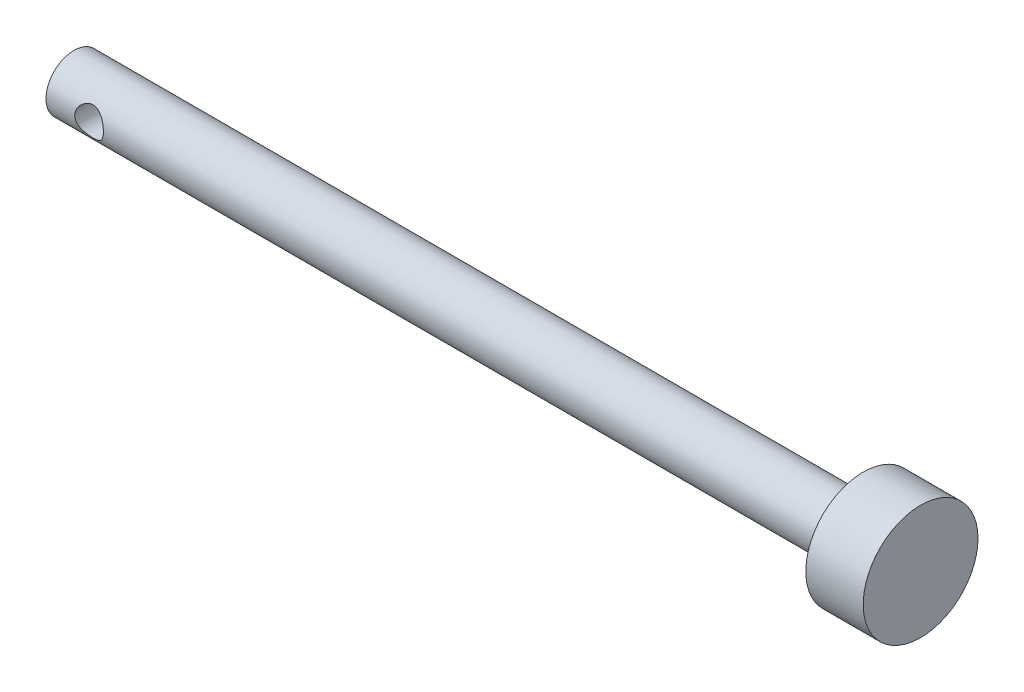
ISO-10303-21;
HEADER;
FILE_DESCRIPTION(('STEP AP214'),'2;1');
FILE_NAME('part.step','',(''),(''),'','','');
FILE_SCHEMA(('AUTOMOTIVE_DESIGN { 1 0 10303 214 1 1 1 1 }'));
ENDSEC;
DATA;
#1=APPLICATION_CONTEXT('core data for automotive mechanical design processes');
#2=APPLICATION_PROTOCOL_DEFINITION('international standard','automotive_design',2000,#1);
#3=PRODUCT_CONTEXT('',#1,'mechanical');
#4=PRODUCT('Part','Part','',(#3));
#5=PRODUCT_RELATED_PRODUCT_CATEGORY('part','',(#4));
#6=PRODUCT_DEFINITION_FORMATION('','',#4);
#7=PRODUCT_DEFINITION_CONTEXT('part definition',#1,'design');
#8=PRODUCT_DEFINITION('design','',#6,#7);
#9=PRODUCT_DEFINITION_SHAPE('','',#8);
#10=(LENGTH_UNIT() NAMED_UNIT(*) SI_UNIT(.MILLI.,.METRE.));
#11=(NAMED_UNIT(*) PLANE_ANGLE_UNIT() SI_UNIT($,.RADIAN.));
#12=(NAMED_UNIT(*) SI_UNIT($,.STERADIAN.) SOLID_ANGLE_UNIT());
#13=UNCERTAINTY_MEASURE_WITH_UNIT(LENGTH_MEASURE(1.E-05),#10,'distance_accuracy_value','');
#14=(GEOMETRIC_REPRESENTATION_CONTEXT(3) GLOBAL_UNCERTAINTY_ASSIGNED_CONTEXT((#13)) GLOBAL_UNIT_ASSIGNED_CONTEXT((#10,
#11,#12)) REPRESENTATION_CONTEXT('',''));
#15=CARTESIAN_POINT('',(0.,0.,0.));
#16=DIRECTION('',(0.,0.,1.));
#17=DIRECTION('',(1.,0.,0.));
#18=AXIS2_PLACEMENT_3D('',#15,#16,#17);
#19=CARTESIAN_POINT('',(-130.,5.,-185.068788376854));
#20=DIRECTION('',(1.,0.,0.));
#21=DIRECTION('',(0.,0.,-1.));
#22=AXIS2_PLACEMENT_3D('',#19,#20,#21);
#23=CYLINDRICAL_SURFACE('',#22,1.95);
#24=CARTESIAN_POINT('',(-130.,5.,-185.068788376854));
#25=DIRECTION('',(-1.,0.,0.));
#26=DIRECTION('',(0.,0.,1.));
#27=AXIS2_PLACEMENT_3D('',#24,#25,#26);
#28=CIRCLE('',#27,1.95);
#29=CARTESIAN_POINT('',(-130.,5.,-183.118788376854));
#30=VERTEX_POINT('',#29);
#31=EDGE_CURVE('E58',#30,#30,#28,.T.);
#32=ORIENTED_EDGE('',*,*,#31,.F.);
#33=EDGE_LOOP('',(#32));
#34=FACE_BOUND('',#33,.T.);
#35=CARTESIAN_POINT('',(-75.,5.,-185.068788376854));
#36=DIRECTION('',(-1.,0.,0.));
#37=DIRECTION('',(0.,0.,1.));
#38=AXIS2_PLACEMENT_3D('',#35,#36,#37);
#39=CIRCLE('',#38,1.95);
#40=CARTESIAN_POINT('',(-75.,5.,-183.118788376854));
#41=VERTEX_POINT('',#40);
#42=EDGE_CURVE('E10',#41,#41,#39,.T.);
#43=ORIENTED_EDGE('',*,*,#42,.T.);
#44=EDGE_LOOP('',(#43));
#45=FACE_BOUND('',#44,.T.);
#46=CARTESIAN_POINT('',(-128.,5.,-183.118788376854));
#47=CARTESIAN_POINT('',(-127.999996620464,4.94759108337758,-183.118791342641));
#48=CARTESIAN_POINT('',(-127.995855818734,4.89512459336798,-183.120923610347));
#49=CARTESIAN_POINT('',(-127.979480639985,4.79175257945733,-183.129243448775));
#50=CARTESIAN_POINT('',(-127.967231955293,4.74084998176109,-183.135438188205));
#51=CARTESIAN_POINT('',(-127.935251360128,4.64225677314356,-183.151237014264));
#52=CARTESIAN_POINT('',(-127.915549015676,4.59455433725935,-183.160827621187));
#53=CARTESIAN_POINT('',(-127.869379042361,4.50320853904555,-183.182547217429));
#54=CARTESIAN_POINT('',(-127.842911723957,4.4595649905696,-183.194676090257));
#55=CARTESIAN_POINT('',(-127.78208188139,4.37449936883816,-183.221261049136));
#56=CARTESIAN_POINT('',(-127.747328483241,4.33338798150986,-183.235815350887));
#57=CARTESIAN_POINT('',(-127.671758494067,4.25728872145519,-183.265306006449));
#58=CARTESIAN_POINT('',(-127.630937071985,4.22230577667981,-183.28024265675));
#59=CARTESIAN_POINT('',(-127.540351028353,4.15655150343715,-183.310236053727));
#60=CARTESIAN_POINT('',(-127.490126109054,4.12636720869555,-183.3252006998));
#61=CARTESIAN_POINT('',(-127.38447186519,4.07500042395737,-183.351896086809));
#62=CARTESIAN_POINT('',(-127.329046427476,4.05381127542808,-183.363629217563));
#63=CARTESIAN_POINT('',(-127.217997847935,4.02245378362002,-183.381419780872));
#64=CARTESIAN_POINT('',(-127.16259353435,4.01169137385369,-183.387780095135));
#65=CARTESIAN_POINT('',(-127.050431537177,3.99968590281392,-183.394892837093));
#66=CARTESIAN_POINT('',(-126.993675388929,3.99843251469846,-183.395651348349));
#67=CARTESIAN_POINT('',(-126.888207459916,4.00504596048992,-183.391715840623));
#68=CARTESIAN_POINT('',(-126.839392170553,4.01177101807173,-183.387704284376));
#69=CARTESIAN_POINT('',(-126.743712890883,4.03216185352695,-183.375883525344));
#70=CARTESIAN_POINT('',(-126.696849585089,4.04583004438014,-183.368073002324));
#71=CARTESIAN_POINT('',(-126.605066014851,4.07995557989579,-183.349369173851));
#72=CARTESIAN_POINT('',(-126.560215707135,4.10056255904908,-183.338408780346));
#73=CARTESIAN_POINT('',(-126.474389241149,4.14786317866561,-183.314632480183));
#74=CARTESIAN_POINT('',(-126.433414835195,4.17455955374698,-183.301815740827));
#75=CARTESIAN_POINT('',(-126.350709866961,4.23745749725883,-183.273693020838));
#76=CARTESIAN_POINT('',(-126.309616852037,4.27445411898591,-183.25828391011));
#77=CARTESIAN_POINT('',(-126.233944759394,4.35485728705557,-183.228099507035));
#78=CARTESIAN_POINT('',(-126.199369110368,4.39826718603037,-183.213324551448));
#79=CARTESIAN_POINT('',(-126.136038477653,4.49306699505331,-183.185152603386));
#80=CARTESIAN_POINT('',(-126.107672104728,4.5447516681197,-183.171864880296));
#81=CARTESIAN_POINT('',(-126.060275312749,4.6530118661604,-183.149114348197));
#82=CARTESIAN_POINT('',(-126.041237124287,4.70958327463303,-183.139648357245));
#83=CARTESIAN_POINT('',(-126.014667729469,4.82082106999128,-183.126300224043));
#84=CARTESIAN_POINT('',(-126.006290891779,4.87523588186213,-183.122009401));
#85=CARTESIAN_POINT('',(-125.998608453844,4.98485921088657,-183.11807756789));
#86=CARTESIAN_POINT('',(-125.999298213837,5.04006730763421,-183.118434179533));
#87=CARTESIAN_POINT('',(-126.009264927649,5.1448624784481,-183.123527064962));
#88=CARTESIAN_POINT('',(-126.017829194087,5.19453770735484,-183.127899819386));
#89=CARTESIAN_POINT('',(-126.042162352432,5.29163839306889,-183.140099076241));
#90=CARTESIAN_POINT('',(-126.057932020757,5.33906360681776,-183.147925950868));
#91=CARTESIAN_POINT('',(-126.096608259316,5.43183220136333,-183.166599482579));
#92=CARTESIAN_POINT('',(-126.119698436484,5.47708301327584,-183.177522962253));
#93=CARTESIAN_POINT('',(-126.172148053646,5.56321097832889,-183.201358750125));
#94=CARTESIAN_POINT('',(-126.201510093501,5.60408630713127,-183.214271882468));
#95=CARTESIAN_POINT('',(-126.26911690628,5.68472876256997,-183.242411940817));
#96=CARTESIAN_POINT('',(-126.307962167423,5.72395780729135,-183.257740533059));
#97=CARTESIAN_POINT('',(-126.391671117905,5.79559686807108,-183.288046471802));
#98=CARTESIAN_POINT('',(-126.436539462893,5.82800155884579,-183.303023535956));
#99=CARTESIAN_POINT('',(-126.534128669672,5.88678271115505,-183.331766017732));
#100=CARTESIAN_POINT('',(-126.587146778343,5.91272600194169,-183.345418417252));
#101=CARTESIAN_POINT('',(-126.697713113057,5.95504664289195,-183.368501617335));
#102=CARTESIAN_POINT('',(-126.755255108812,5.97143689637542,-183.377938108296));
#103=CARTESIAN_POINT('',(-126.867265963837,5.99262615208895,-183.390297828959));
#104=CARTESIAN_POINT('',(-126.921489151034,5.99839773058936,-183.393765415788));
#105=CARTESIAN_POINT('',(-127.030217072277,6.00101911322247,-183.395329251626));
#106=CARTESIAN_POINT('',(-127.084721646878,5.99787351229821,-183.393428267015));
#107=CARTESIAN_POINT('',(-127.186415432421,5.98367024004767,-183.385058321769));
#108=CARTESIAN_POINT('',(-127.233772175934,5.97347732594975,-183.379089556933));
#109=CARTESIAN_POINT('',(-127.326038504816,5.94657788225723,-183.363875584739));
#110=CARTESIAN_POINT('',(-127.370947260521,5.92986915980158,-183.354629274438));
#111=CARTESIAN_POINT('',(-127.460366675731,5.88917656487865,-183.333154074832));
#112=CARTESIAN_POINT('',(-127.504651452442,5.86478214220122,-183.320767510563));
#113=CARTESIAN_POINT('',(-127.588792542593,5.80984624416505,-183.29464800787));
#114=CARTESIAN_POINT('',(-127.628646482184,5.7793014981328,-183.28091435508));
#115=CARTESIAN_POINT('',(-127.708197395355,5.70827730046386,-183.251509026301));
#116=CARTESIAN_POINT('',(-127.74719843868,5.66702216703368,-183.235817815661));
#117=CARTESIAN_POINT('',(-127.817901471002,5.57815343172522,-183.205877753116));
#118=CARTESIAN_POINT('',(-127.849599260685,5.53053619642241,-183.191629733659));
#119=CARTESIAN_POINT('',(-127.905027068167,5.42930076675533,-183.165905560046));
#120=CARTESIAN_POINT('',(-127.92864749954,5.37561225628971,-183.154468079837));
#121=CARTESIAN_POINT('',(-127.966209437387,5.26432311934789,-183.135969107731));
#122=CARTESIAN_POINT('',(-127.980177864351,5.20673386978134,-183.128895450622));
#123=CARTESIAN_POINT('',(-127.992623029204,5.123761107182,-183.122562944566));
#124=CARTESIAN_POINT('',(-127.995385024686,5.09911610673589,-183.121151601877));
#125=CARTESIAN_POINT('',(-127.999074334391,5.04965171566804,-183.119263603342));
#126=CARTESIAN_POINT('',(-128.000001601287,5.02483232056433,-183.118786971609));
#127=CARTESIAN_POINT('',(-128.,5.,-183.118788376854));
#128=B_SPLINE_CURVE_WITH_KNOTS('',3,(#46,#47,#48,#49,#50,#51,#52,#53,#54,#55,#56,#57,#58,#59,
#60,#61,#62,#63,#64,#65,#66,#67,#68,#69,#70,#71,#72,#73,#74,#75,#76,#77,#78,#79,#80,#81,#82,#83,
#84,#85,#86,#87,#88,#89,#90,#91,#92,#93,#94,#95,#96,#97,#98,#99,#100,#101,#102,#103,#104,#105,
#106,#107,#108,#109,#110,#111,#112,#113,#114,#115,#116,#117,#118,#119,#120,#121,#122,#123,#124,
#125,#126,#127),.UNSPECIFIED.,.T.,.F.,(4,2,2,2,2,2,2,2,2,2,2,2,2,2,2,2,2,2,2,2,2,2,2,2,2,2,2,2,
2,2,2,2,2,2,2,2,2,2,2,2,4),(0.,0.157126222675768,0.314530461838704,0.471316771763537,
0.628095887695222,0.794701467286486,0.961440407466392,1.14195989320118,1.3223455178832,
1.49171388456966,1.66089829005158,1.80852469061709,1.95620243161685,2.10729389131889,
2.25845333703525,2.42991445026206,2.60146551649505,2.78179916732774,2.9619823625902,
3.12673896348067,3.29141125470762,3.44250661341208,3.5936182572384,3.74886783211249,
3.90418188752254,4.07533433245377,4.24661984280491,4.42739014783215,4.60791571654676,
4.77087789198296,4.93375610972962,5.07954523270104,5.22538346263809,5.38093849776559,
5.53657647484824,5.7124768574219,5.88847813034193,6.06678039770734,6.24458333124538,
6.31903074091941,6.39348007095719),.UNSPECIFIED.);
#129=CARTESIAN_POINT('',(-128.,5.,-183.118788376854));
#130=VERTEX_POINT('',#129);
#131=EDGE_CURVE('E61',#130,#130,#128,.T.);
#132=ORIENTED_EDGE('',*,*,#131,.F.);
#133=EDGE_LOOP('',(#132));
#134=FACE_BOUND('',#133,.T.);
#135=CARTESIAN_POINT('',(-128.,5.,-187.018788376854));
#136=CARTESIAN_POINT('',(-127.999996620464,5.05240891662242,-187.018785411067));
#137=CARTESIAN_POINT('',(-127.995855818734,5.10487540663203,-187.016653143361));
#138=CARTESIAN_POINT('',(-127.979480639985,5.20824742054268,-187.008333304933));
#139=CARTESIAN_POINT('',(-127.967231955293,5.25915001823891,-187.002138565503));
#140=CARTESIAN_POINT('',(-127.935251360128,5.35774322685644,-186.986339739444));
#141=CARTESIAN_POINT('',(-127.915549015676,5.40544566274066,-186.976749132521));
#142=CARTESIAN_POINT('',(-127.869379042361,5.49679146095446,-186.955029536279));
#143=CARTESIAN_POINT('',(-127.842911723957,5.5404350094304,-186.942900663451));
#144=CARTESIAN_POINT('',(-127.78208188139,5.62550063116183,-186.916315704572));
#145=CARTESIAN_POINT('',(-127.747328483241,5.66661201849013,-186.901761402821));
#146=CARTESIAN_POINT('',(-127.671758494067,5.7427112785448,-186.872270747259));
#147=CARTESIAN_POINT('',(-127.630937071985,5.77769422332019,-186.857334096958));
#148=CARTESIAN_POINT('',(-127.540351028353,5.84344849656287,-186.827340699981));
#149=CARTESIAN_POINT('',(-127.490126109054,5.87363279130447,-186.812376053908));
#150=CARTESIAN_POINT('',(-127.384471865189,5.92499957604266,-186.785680666899));
#151=CARTESIAN_POINT('',(-127.329046427476,5.94618872457193,-186.773947536145));
#152=CARTESIAN_POINT('',(-127.217997847935,5.97754621637999,-186.756156972836));
#153=CARTESIAN_POINT('',(-127.16259353435,5.98830862614631,-186.749796658573));
#154=CARTESIAN_POINT('',(-127.050431537177,6.00031409718609,-186.742683916615));
#155=CARTESIAN_POINT('',(-126.993675388929,6.00156748530154,-186.741925405359));
#156=CARTESIAN_POINT('',(-126.888207459916,5.99495403951009,-186.745860913085));
#157=CARTESIAN_POINT('',(-126.839392170553,5.98822898192828,-186.749872469332));
#158=CARTESIAN_POINT('',(-126.743712890883,5.96783814647306,-186.761693228365));
#159=CARTESIAN_POINT('',(-126.696849585089,5.95416995561987,-186.769503751384));
#160=CARTESIAN_POINT('',(-126.605066014851,5.92004442010422,-186.788207579857));
#161=CARTESIAN_POINT('',(-126.560215707135,5.89943744095093,-186.799167973362));
#162=CARTESIAN_POINT('',(-126.474389241149,5.8521368213344,-186.822944273525));
#163=CARTESIAN_POINT('',(-126.433414835195,5.82544044625303,-186.835761012881));
#164=CARTESIAN_POINT('',(-126.350709866961,5.76254250274117,-186.86388373287));
#165=CARTESIAN_POINT('',(-126.309616852037,5.72554588101409,-186.879292843598));
#166=CARTESIAN_POINT('',(-126.233944759394,5.64514271294444,-186.909477246673));
#167=CARTESIAN_POINT('',(-126.199369110368,5.60173281396964,-186.92425220226));
#168=CARTESIAN_POINT('',(-126.136038477653,5.50693300494671,-186.952424150322));
#169=CARTESIAN_POINT('',(-126.107672104728,5.45524833188031,-186.965711873412));
#170=CARTESIAN_POINT('',(-126.060275312749,5.34698813383961,-186.988462405511));
#171=CARTESIAN_POINT('',(-126.041237124287,5.29041672536698,-186.997928396463));
#172=CARTESIAN_POINT('',(-126.014667729469,5.17917893000874,-187.011276529666));
#173=CARTESIAN_POINT('',(-126.006290891779,5.12476411813789,-187.015567352708));
#174=CARTESIAN_POINT('',(-125.998608453844,5.01514078911345,-187.019499185818));
#175=CARTESIAN_POINT('',(-125.999298213837,4.95993269236581,-187.019142574175));
#176=CARTESIAN_POINT('',(-126.009264927649,4.85513752155192,-187.014049688747));
#177=CARTESIAN_POINT('',(-126.017829194087,4.80546229264518,-187.009676934322));
#178=CARTESIAN_POINT('',(-126.042162352432,4.70836160693112,-186.997477677467));
#179=CARTESIAN_POINT('',(-126.057932020757,4.66093639318226,-186.989650802841));
#180=CARTESIAN_POINT('',(-126.096608259316,4.5681677986367,-186.970977271129));
#181=CARTESIAN_POINT('',(-126.119698436484,4.52291698672418,-186.960053791455));
#182=CARTESIAN_POINT('',(-126.172148053646,4.43678902167113,-186.936218003583));
#183=CARTESIAN_POINT('',(-126.2015100935,4.39591369286876,-186.92330487124));
#184=CARTESIAN_POINT('',(-126.26911690628,4.31527123743007,-186.895164812892));
#185=CARTESIAN_POINT('',(-126.307962167423,4.27604219270867,-186.879836220649));
#186=CARTESIAN_POINT('',(-126.391671117905,4.20440313192893,-186.849530281906));
#187=CARTESIAN_POINT('',(-126.436539462893,4.17199844115422,-186.834553217752));
#188=CARTESIAN_POINT('',(-126.534128669672,4.11321728884497,-186.805810735976));
#189=CARTESIAN_POINT('',(-126.587146778343,4.08727399805832,-186.792158336456));
#190=CARTESIAN_POINT('',(-126.697713113057,4.04495335710806,-186.769075136373));
#191=CARTESIAN_POINT('',(-126.755255108812,4.02856310362459,-186.759638645412));
#192=CARTESIAN_POINT('',(-126.867265963837,4.00737384791106,-186.747278924749));
#193=CARTESIAN_POINT('',(-126.921489151034,4.00160226941065,-186.74381133792));
#194=CARTESIAN_POINT('',(-127.030217072277,3.99898088677754,-186.742247502082));
#195=CARTESIAN_POINT('',(-127.084721646878,4.0021264877018,-186.744148486693));
#196=CARTESIAN_POINT('',(-127.186415432421,4.01632975995234,-186.752518431939));
#197=CARTESIAN_POINT('',(-127.233772175934,4.02652267405026,-186.758487196776));
#198=CARTESIAN_POINT('',(-127.326038504816,4.05342211774278,-186.773701168969));
#199=CARTESIAN_POINT('',(-127.370947260521,4.07013084019843,-186.78294747927));
#200=CARTESIAN_POINT('',(-127.460366675731,4.11082343512135,-186.804422678876));
#201=CARTESIAN_POINT('',(-127.504651452442,4.13521785779877,-186.816809243145));
#202=CARTESIAN_POINT('',(-127.588792542592,4.19015375583493,-186.842928745838));
#203=CARTESIAN_POINT('',(-127.628646482184,4.22069850186719,-186.856662398628));
#204=CARTESIAN_POINT('',(-127.708197395355,4.29172269953615,-186.886067727407));
#205=CARTESIAN_POINT('',(-127.74719843868,4.33297783296633,-186.901758938047));
#206=CARTESIAN_POINT('',(-127.817901471002,4.42184656827479,-186.931699000593));
#207=CARTESIAN_POINT('',(-127.849599260685,4.4694638035776,-186.945947020049));
#208=CARTESIAN_POINT('',(-127.905027068167,4.57069923324467,-186.971671193662));
#209=CARTESIAN_POINT('',(-127.92864749954,4.6243877437103,-186.983108673871));
#210=CARTESIAN_POINT('',(-127.966209437387,4.73567688065211,-187.001607645977));
#211=CARTESIAN_POINT('',(-127.980177864351,4.79326613021866,-187.008681303087));
#212=CARTESIAN_POINT('',(-127.992623029204,4.876238892818,-187.015013809142));
#213=CARTESIAN_POINT('',(-127.995385024686,4.90088389326411,-187.016425151832));
#214=CARTESIAN_POINT('',(-127.999074334391,4.95034828433196,-187.018313150366));
#215=CARTESIAN_POINT('',(-128.000001601287,4.97516767943568,-187.018789782099));
#216=CARTESIAN_POINT('',(-128.,5.,-187.018788376854));
#217=B_SPLINE_CURVE_WITH_KNOTS('',3,(#135,#136,#137,#138,#139,#140,#141,#142,#143,#144,#145,
#146,#147,#148,#149,#150,#151,#152,#153,#154,#155,#156,#157,#158,#159,#160,#161,#162,#163,#164,
#165,#166,#167,#168,#169,#170,#171,#172,#173,#174,#175,#176,#177,#178,#179,#180,#181,#182,#183,
#184,#185,#186,#187,#188,#189,#190,#191,#192,#193,#194,#195,#196,#197,#198,#199,#200,#201,#202,
#203,#204,#205,#206,#207,#208,#209,#210,#211,#212,#213,#214,#215,#216),.UNSPECIFIED.,.T.,.F.,(4,
2,2,2,2,2,2,2,2,2,2,2,2,2,2,2,2,2,2,2,2,2,2,2,2,2,2,2,2,2,2,2,2,2,2,2,2,2,2,2,4),(0.,
0.157126222675768,0.314530461838704,0.471316771763542,0.628095887695223,0.794701467286455,
0.961440407466396,1.14195989320125,1.3223455178832,1.49171388456964,1.66089829005153,
1.8085246906171,1.95620243161685,2.10729389131889,2.25845333703526,2.42991445026207,
2.60146551649505,2.78179916732774,2.9619823625902,3.12673896348067,3.29141125470761,
3.44250661341209,3.5936182572384,3.74886783211247,3.90418188752253,4.07533433245375,
4.24661984280491,4.42739014783215,4.60791571654674,4.77087789198296,4.93375610972963,
5.07954523270105,5.22538346263809,5.38093849776553,5.53657647484824,5.7124768574219,
5.88847813034193,6.06678039770734,6.24458333124537,6.3190307409194,6.39348007095719),.UNSPECIFIED.);
#218=CARTESIAN_POINT('',(-128.,5.,-187.018788376854));
#219=VERTEX_POINT('',#218);
#220=EDGE_CURVE('E41',#219,#219,#217,.T.);
#221=ORIENTED_EDGE('',*,*,#220,.F.);
#222=EDGE_LOOP('',(#221));
#223=FACE_BOUND('',#222,.T.);
#224=ADVANCED_FACE('F37',(#34,#45,#134,#223),#23,.T.);
#225=CARTESIAN_POINT('',(-75.,5.,-185.068788376854));
#226=DIRECTION('',(1.,0.,0.));
#227=DIRECTION('',(0.,0.,-1.));
#228=AXIS2_PLACEMENT_3D('',#225,#226,#227);
#229=CYLINDRICAL_SURFACE('',#228,3.99999999999999);
#230=CARTESIAN_POINT('',(-75.,5.,-185.068788376854));
#231=DIRECTION('',(1.,0.,0.));
#232=DIRECTION('',(0.,0.,-1.));
#233=AXIS2_PLACEMENT_3D('',#230,#231,#232);
#234=CIRCLE('',#233,3.99999999999999);
#235=CARTESIAN_POINT('',(-75.,5.,-189.068788376854));
#236=VERTEX_POINT('',#235);
#237=EDGE_CURVE('E50',#236,#236,#234,.T.);
#238=ORIENTED_EDGE('',*,*,#237,.T.);
#239=EDGE_LOOP('',(#238));
#240=FACE_BOUND('',#239,.T.);
#241=CARTESIAN_POINT('',(-71.,5.,-185.068788376854));
#242=DIRECTION('',(1.,0.,0.));
#243=DIRECTION('',(0.,0.,-1.));
#244=AXIS2_PLACEMENT_3D('',#241,#242,#243);
#245=CIRCLE('',#244,3.99999999999999);
#246=CARTESIAN_POINT('',(-71.,5.,-189.068788376854));
#247=VERTEX_POINT('',#246);
#248=EDGE_CURVE('E55',#247,#247,#245,.T.);
#249=ORIENTED_EDGE('',*,*,#248,.F.);
#250=EDGE_LOOP('',(#249));
#251=FACE_BOUND('',#250,.T.);
#252=ADVANCED_FACE('F39',(#240,#251),#229,.T.);
#253=CARTESIAN_POINT('',(-75.,5.,-185.068788376854));
#254=DIRECTION('',(1.,0.,0.));
#255=DIRECTION('',(0.,0.,-1.));
#256=AXIS2_PLACEMENT_3D('',#253,#254,#255);
#257=PLANE('',#256);
#258=ORIENTED_EDGE('',*,*,#42,.F.);
#259=EDGE_LOOP('',(#258));
#260=FACE_BOUND('',#259,.T.);
#261=ORIENTED_EDGE('',*,*,#237,.F.);
#262=EDGE_LOOP('',(#261));
#263=FACE_BOUND('',#262,.T.);
#264=ADVANCED_FACE('F82',(#260,#263),#257,.F.);
#265=CARTESIAN_POINT('',(-71.,5.,-185.068788376854));
#266=DIRECTION('',(1.,0.,0.));
#267=DIRECTION('',(0.,0.,-1.));
#268=AXIS2_PLACEMENT_3D('',#265,#266,#267);
#269=PLANE('',#268);
#270=ORIENTED_EDGE('',*,*,#248,.T.);
#271=EDGE_LOOP('',(#270));
#272=FACE_BOUND('',#271,.T.);
#273=ADVANCED_FACE('F76',(#272),#269,.T.);
#274=CARTESIAN_POINT('',(-130.,5.,-185.068788376854));
#275=DIRECTION('',(-1.,0.,0.));
#276=DIRECTION('',(0.,0.,1.));
#277=AXIS2_PLACEMENT_3D('',#274,#275,#276);
#278=PLANE('',#277);
#279=ORIENTED_EDGE('',*,*,#31,.T.);
#280=EDGE_LOOP('',(#279));
#281=FACE_BOUND('',#280,.T.);
#282=ADVANCED_FACE('F72',(#281),#278,.T.);
#283=CARTESIAN_POINT('',(-127.,5.,-150.));
#284=DIRECTION('',(0.,0.,-1.));
#285=DIRECTION('',(-1.,0.,0.));
#286=AXIS2_PLACEMENT_3D('',#283,#284,#285);
#287=CYLINDRICAL_SURFACE('',#286,0.999999999999998);
#288=ORIENTED_EDGE('',*,*,#131,.T.);
#289=EDGE_LOOP('',(#288));
#290=FACE_BOUND('',#289,.T.);
#291=ORIENTED_EDGE('',*,*,#220,.T.);
#292=EDGE_LOOP('',(#291));
#293=FACE_BOUND('',#292,.T.);
#294=ADVANCED_FACE('F69',(#290,#293),#287,.F.);
#295=CLOSED_SHELL('',(#224,#252,#264,#273,#282,#294));
#296=MANIFOLD_SOLID_BREP('B2',#295);
#297=ADVANCED_BREP_SHAPE_REPRESENTATION('',(#18,#296),#14);
#298=SHAPE_DEFINITION_REPRESENTATION(#9,#297);
ENDSEC;
END-ISO-10303-21;
